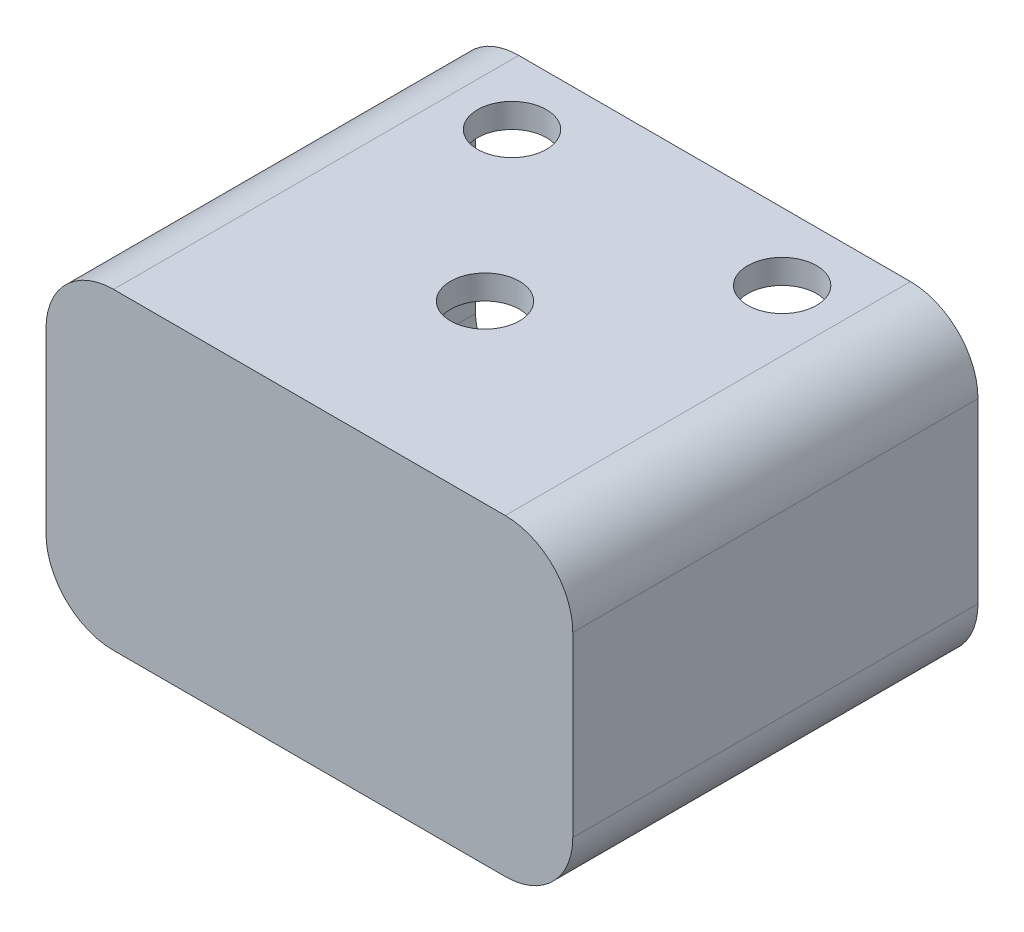
ISO-10303-21;
HEADER;
FILE_DESCRIPTION(('STEP AP214'),'2;1');
FILE_NAME('part.step','',(''),(''),'','','');
FILE_SCHEMA(('AUTOMOTIVE_DESIGN { 1 0 10303 214 1 1 1 1 }'));
ENDSEC;
DATA;
#1=APPLICATION_CONTEXT('core data for automotive mechanical design processes');
#2=APPLICATION_PROTOCOL_DEFINITION('international standard','automotive_design',2000,#1);
#3=PRODUCT_CONTEXT('',#1,'mechanical');
#4=PRODUCT('Part','Part','',(#3));
#5=PRODUCT_RELATED_PRODUCT_CATEGORY('part','',(#4));
#6=PRODUCT_DEFINITION_FORMATION('','',#4);
#7=PRODUCT_DEFINITION_CONTEXT('part definition',#1,'design');
#8=PRODUCT_DEFINITION('design','',#6,#7);
#9=PRODUCT_DEFINITION_SHAPE('','',#8);
#10=(LENGTH_UNIT() NAMED_UNIT(*) SI_UNIT(.MILLI.,.METRE.));
#11=(NAMED_UNIT(*) PLANE_ANGLE_UNIT() SI_UNIT($,.RADIAN.));
#12=(NAMED_UNIT(*) SI_UNIT($,.STERADIAN.) SOLID_ANGLE_UNIT());
#13=UNCERTAINTY_MEASURE_WITH_UNIT(LENGTH_MEASURE(1.E-05),#10,'distance_accuracy_value','');
#14=(GEOMETRIC_REPRESENTATION_CONTEXT(3) GLOBAL_UNCERTAINTY_ASSIGNED_CONTEXT((#13)) GLOBAL_UNIT_ASSIGNED_CONTEXT((#10,
#11,#12)) REPRESENTATION_CONTEXT('',''));
#15=CARTESIAN_POINT('',(0.,0.,0.));
#16=DIRECTION('',(0.,0.,1.));
#17=DIRECTION('',(1.,0.,0.));
#18=AXIS2_PLACEMENT_3D('',#15,#16,#17);
#19=CARTESIAN_POINT('',(30.5,1.5,309.8));
#20=DIRECTION('',(0.,0.,-1.));
#21=DIRECTION('',(-1.,0.,0.));
#22=AXIS2_PLACEMENT_3D('',#19,#20,#21);
#23=CYLINDRICAL_SURFACE('',#22,5.);
#24=DIRECTION('',(0.,0.,-1.));
#25=VECTOR('',#24,1.);
#26=CARTESIAN_POINT('',(30.5,-3.5,309.8));
#27=LINE('',#26,#25);
#28=CARTESIAN_POINT('',(30.5,-3.5,309.8));
#29=VERTEX_POINT('',#28);
#30=CARTESIAN_POINT('',(30.5,-3.5,279.8));
#31=VERTEX_POINT('',#30);
#32=EDGE_CURVE('E261',#29,#31,#27,.T.);
#33=ORIENTED_EDGE('',*,*,#32,.T.);
#34=CARTESIAN_POINT('',(30.5,1.5,279.8));
#35=DIRECTION('',(0.,0.,-1.));
#36=DIRECTION('',(-1.,0.,0.));
#37=AXIS2_PLACEMENT_3D('',#34,#35,#36);
#38=CIRCLE('',#37,5.);
#39=CARTESIAN_POINT('',(35.5,1.50000000000001,279.8));
#40=VERTEX_POINT('',#39);
#41=EDGE_CURVE('E168',#40,#31,#38,.T.);
#42=ORIENTED_EDGE('',*,*,#41,.F.);
#43=DIRECTION('',(0.,0.,-1.));
#44=VECTOR('',#43,1.);
#45=CARTESIAN_POINT('',(35.5,1.5,309.8));
#46=LINE('',#45,#44);
#47=CARTESIAN_POINT('',(35.5,1.5,309.8));
#48=VERTEX_POINT('',#47);
#49=EDGE_CURVE('E11',#48,#40,#46,.T.);
#50=ORIENTED_EDGE('',*,*,#49,.F.);
#51=CARTESIAN_POINT('',(30.5,1.5,309.8));
#52=DIRECTION('',(0.,0.,1.));
#53=DIRECTION('',(1.,0.,0.));
#54=AXIS2_PLACEMENT_3D('',#51,#52,#53);
#55=CIRCLE('',#54,5.);
#56=EDGE_CURVE('E246',#29,#48,#55,.T.);
#57=ORIENTED_EDGE('',*,*,#56,.F.);
#58=EDGE_LOOP('',(#33,#42,#50,#57));
#59=FACE_BOUND('',#58,.T.);
#60=ADVANCED_FACE('F37',(#59),#23,.T.);
#61=CARTESIAN_POINT('',(35.5,1.5,309.8));
#62=DIRECTION('',(-1.,0.,0.));
#63=DIRECTION('',(0.,0.,1.));
#64=AXIS2_PLACEMENT_3D('',#61,#62,#63);
#65=PLANE('',#64);
#66=ORIENTED_EDGE('',*,*,#49,.T.);
#67=DIRECTION('',(0.,-1.,0.));
#68=VECTOR('',#67,1.);
#69=CARTESIAN_POINT('',(35.5,14.65,279.8));
#70=LINE('',#69,#68);
#71=CARTESIAN_POINT('',(35.5,14.65,279.8));
#72=VERTEX_POINT('',#71);
#73=EDGE_CURVE('E243',#72,#40,#70,.T.);
#74=ORIENTED_EDGE('',*,*,#73,.F.);
#75=DIRECTION('',(0.,0.,-1.));
#76=VECTOR('',#75,1.);
#77=CARTESIAN_POINT('',(35.5,14.65,309.8));
#78=LINE('',#77,#76);
#79=CARTESIAN_POINT('',(35.5,14.65,309.8));
#80=VERTEX_POINT('',#79);
#81=EDGE_CURVE('E45',#80,#72,#78,.T.);
#82=ORIENTED_EDGE('',*,*,#81,.F.);
#83=DIRECTION('',(0.,1.,0.));
#84=VECTOR('',#83,1.);
#85=CARTESIAN_POINT('',(35.5,1.5,309.8));
#86=LINE('',#85,#84);
#87=EDGE_CURVE('E248',#48,#80,#86,.T.);
#88=ORIENTED_EDGE('',*,*,#87,.F.);
#89=EDGE_LOOP('',(#66,#74,#82,#88));
#90=FACE_BOUND('',#89,.T.);
#91=ADVANCED_FACE('F336',(#90),#65,.F.);
#92=CARTESIAN_POINT('',(30.5,14.65,309.8));
#93=DIRECTION('',(0.,0.,-1.));
#94=DIRECTION('',(-1.,0.,0.));
#95=AXIS2_PLACEMENT_3D('',#92,#93,#94);
#96=CYLINDRICAL_SURFACE('',#95,5.00000000000001);
#97=ORIENTED_EDGE('',*,*,#81,.T.);
#98=CARTESIAN_POINT('',(30.5,14.65,279.8));
#99=DIRECTION('',(0.,0.,-1.));
#100=DIRECTION('',(-1.,0.,0.));
#101=AXIS2_PLACEMENT_3D('',#98,#99,#100);
#102=CIRCLE('',#101,5.00000000000001);
#103=CARTESIAN_POINT('',(30.5,19.65,279.8));
#104=VERTEX_POINT('',#103);
#105=EDGE_CURVE('E240',#104,#72,#102,.T.);
#106=ORIENTED_EDGE('',*,*,#105,.F.);
#107=DIRECTION('',(0.,0.,-1.));
#108=VECTOR('',#107,1.);
#109=CARTESIAN_POINT('',(30.5,19.65,309.8));
#110=LINE('',#109,#108);
#111=CARTESIAN_POINT('',(30.5,19.65,309.8));
#112=VERTEX_POINT('',#111);
#113=EDGE_CURVE('E271',#112,#104,#110,.T.);
#114=ORIENTED_EDGE('',*,*,#113,.F.);
#115=CARTESIAN_POINT('',(30.5,14.65,309.8));
#116=DIRECTION('',(0.,0.,1.));
#117=DIRECTION('',(1.,0.,0.));
#118=AXIS2_PLACEMENT_3D('',#115,#116,#117);
#119=CIRCLE('',#118,5.00000000000001);
#120=EDGE_CURVE('E250',#80,#112,#119,.T.);
#121=ORIENTED_EDGE('',*,*,#120,.F.);
#122=EDGE_LOOP('',(#97,#106,#114,#121));
#123=FACE_BOUND('',#122,.T.);
#124=ADVANCED_FACE('F341',(#123),#96,.T.);
#125=CARTESIAN_POINT('',(30.5,19.65,309.8));
#126=DIRECTION('',(0.,-1.,0.));
#127=DIRECTION('',(1.,0.,0.));
#128=AXIS2_PLACEMENT_3D('',#125,#126,#127);
#129=PLANE('',#128);
#130=CARTESIAN_POINT('',(16.,19.65,296.8));
#131=DIRECTION('',(0.,1.,0.));
#132=DIRECTION('',(-1.,0.,0.));
#133=AXIS2_PLACEMENT_3D('',#130,#131,#132);
#134=CIRCLE('',#133,2.55);
#135=CARTESIAN_POINT('',(13.45,19.65,296.8));
#136=VERTEX_POINT('',#135);
#137=EDGE_CURVE('E649',#136,#136,#134,.T.);
#138=ORIENTED_EDGE('',*,*,#137,.F.);
#139=EDGE_LOOP('',(#138));
#140=FACE_BOUND('',#139,.T.);
#141=CARTESIAN_POINT('',(26.,19.65,284.8));
#142=DIRECTION('',(0.,1.,0.));
#143=DIRECTION('',(-1.,0.,0.));
#144=AXIS2_PLACEMENT_3D('',#141,#142,#143);
#145=CIRCLE('',#144,2.55);
#146=CARTESIAN_POINT('',(23.45,19.65,284.8));
#147=VERTEX_POINT('',#146);
#148=EDGE_CURVE('E650',#147,#147,#145,.T.);
#149=ORIENTED_EDGE('',*,*,#148,.F.);
#150=EDGE_LOOP('',(#149));
#151=FACE_BOUND('',#150,.T.);
#152=CARTESIAN_POINT('',(5.99999999999999,19.65,284.8));
#153=DIRECTION('',(0.,1.,0.));
#154=DIRECTION('',(-1.,0.,0.));
#155=AXIS2_PLACEMENT_3D('',#152,#153,#154);
#156=CIRCLE('',#155,2.55000000000001);
#157=CARTESIAN_POINT('',(3.44999999999999,19.65,284.8));
#158=VERTEX_POINT('',#157);
#159=EDGE_CURVE('E659',#158,#158,#156,.T.);
#160=ORIENTED_EDGE('',*,*,#159,.F.);
#161=EDGE_LOOP('',(#160));
#162=FACE_BOUND('',#161,.T.);
#163=ORIENTED_EDGE('',*,*,#113,.T.);
#164=DIRECTION('',(1.,0.,0.));
#165=VECTOR('',#164,1.);
#166=CARTESIAN_POINT('',(1.5,19.65,279.8));
#167=LINE('',#166,#165);
#168=CARTESIAN_POINT('',(1.5,19.65,279.8));
#169=VERTEX_POINT('',#168);
#170=EDGE_CURVE('E237',#169,#104,#167,.T.);
#171=ORIENTED_EDGE('',*,*,#170,.F.);
#172=DIRECTION('',(0.,0.,-1.));
#173=VECTOR('',#172,1.);
#174=CARTESIAN_POINT('',(1.5,19.65,309.8));
#175=LINE('',#174,#173);
#176=CARTESIAN_POINT('',(1.5,19.65,309.8));
#177=VERTEX_POINT('',#176);
#178=EDGE_CURVE('E269',#177,#169,#175,.T.);
#179=ORIENTED_EDGE('',*,*,#178,.F.);
#180=DIRECTION('',(-1.,0.,0.));
#181=VECTOR('',#180,1.);
#182=CARTESIAN_POINT('',(30.5,19.65,309.8));
#183=LINE('',#182,#181);
#184=EDGE_CURVE('E252',#112,#177,#183,.T.);
#185=ORIENTED_EDGE('',*,*,#184,.F.);
#186=EDGE_LOOP('',(#163,#171,#179,#185));
#187=FACE_BOUND('',#186,.T.);
#188=ADVANCED_FACE('F379',(#140,#151,#162,#187),#129,.F.);
#189=CARTESIAN_POINT('',(1.5,14.65,309.8));
#190=DIRECTION('',(0.,0.,-1.));
#191=DIRECTION('',(-1.,0.,0.));
#192=AXIS2_PLACEMENT_3D('',#189,#190,#191);
#193=CYLINDRICAL_SURFACE('',#192,5.);
#194=ORIENTED_EDGE('',*,*,#178,.T.);
#195=CARTESIAN_POINT('',(1.5,14.65,279.8));
#196=DIRECTION('',(0.,0.,-1.));
#197=DIRECTION('',(-1.,0.,0.));
#198=AXIS2_PLACEMENT_3D('',#195,#196,#197);
#199=CIRCLE('',#198,5.);
#200=CARTESIAN_POINT('',(-3.5,14.65,279.8));
#201=VERTEX_POINT('',#200);
#202=EDGE_CURVE('E234',#201,#169,#199,.T.);
#203=ORIENTED_EDGE('',*,*,#202,.F.);
#204=DIRECTION('',(0.,0.,-1.));
#205=VECTOR('',#204,1.);
#206=CARTESIAN_POINT('',(-3.5,14.65,309.8));
#207=LINE('',#206,#205);
#208=CARTESIAN_POINT('',(-3.5,14.65,309.8));
#209=VERTEX_POINT('',#208);
#210=EDGE_CURVE('E267',#209,#201,#207,.T.);
#211=ORIENTED_EDGE('',*,*,#210,.F.);
#212=CARTESIAN_POINT('',(1.5,14.65,309.8));
#213=DIRECTION('',(0.,0.,1.));
#214=DIRECTION('',(1.,0.,0.));
#215=AXIS2_PLACEMENT_3D('',#212,#213,#214);
#216=CIRCLE('',#215,5.);
#217=EDGE_CURVE('E254',#177,#209,#216,.T.);
#218=ORIENTED_EDGE('',*,*,#217,.F.);
#219=EDGE_LOOP('',(#194,#203,#211,#218));
#220=FACE_BOUND('',#219,.T.);
#221=ADVANCED_FACE('F375',(#220),#193,.T.);
#222=CARTESIAN_POINT('',(-3.5,14.65,309.8));
#223=DIRECTION('',(1.,0.,0.));
#224=DIRECTION('',(0.,1.,0.));
#225=AXIS2_PLACEMENT_3D('',#222,#223,#224);
#226=PLANE('',#225);
#227=ORIENTED_EDGE('',*,*,#210,.T.);
#228=DIRECTION('',(0.,1.,0.));
#229=VECTOR('',#228,1.);
#230=CARTESIAN_POINT('',(-3.5,1.5,279.8));
#231=LINE('',#230,#229);
#232=CARTESIAN_POINT('',(-3.5,1.5,279.8));
#233=VERTEX_POINT('',#232);
#234=EDGE_CURVE('E231',#233,#201,#231,.T.);
#235=ORIENTED_EDGE('',*,*,#234,.F.);
#236=DIRECTION('',(0.,0.,-1.));
#237=VECTOR('',#236,1.);
#238=CARTESIAN_POINT('',(-3.5,1.5,309.8));
#239=LINE('',#238,#237);
#240=CARTESIAN_POINT('',(-3.5,1.5,309.8));
#241=VERTEX_POINT('',#240);
#242=EDGE_CURVE('E265',#241,#233,#239,.T.);
#243=ORIENTED_EDGE('',*,*,#242,.F.);
#244=DIRECTION('',(0.,-1.,0.));
#245=VECTOR('',#244,1.);
#246=CARTESIAN_POINT('',(-3.5,14.65,309.8));
#247=LINE('',#246,#245);
#248=EDGE_CURVE('E256',#209,#241,#247,.T.);
#249=ORIENTED_EDGE('',*,*,#248,.F.);
#250=EDGE_LOOP('',(#227,#235,#243,#249));
#251=FACE_BOUND('',#250,.T.);
#252=ADVANCED_FACE('F371',(#251),#226,.F.);
#253=CARTESIAN_POINT('',(1.5,1.5,309.8));
#254=DIRECTION('',(0.,0.,-1.));
#255=DIRECTION('',(-1.,0.,0.));
#256=AXIS2_PLACEMENT_3D('',#253,#254,#255);
#257=CYLINDRICAL_SURFACE('',#256,5.);
#258=ORIENTED_EDGE('',*,*,#242,.T.);
#259=CARTESIAN_POINT('',(1.5,1.5,279.8));
#260=DIRECTION('',(0.,0.,-1.));
#261=DIRECTION('',(-1.,0.,0.));
#262=AXIS2_PLACEMENT_3D('',#259,#260,#261);
#263=CIRCLE('',#262,5.);
#264=CARTESIAN_POINT('',(1.5,-3.5,279.8));
#265=VERTEX_POINT('',#264);
#266=EDGE_CURVE('E228',#265,#233,#263,.T.);
#267=ORIENTED_EDGE('',*,*,#266,.F.);
#268=DIRECTION('',(0.,0.,-1.));
#269=VECTOR('',#268,1.);
#270=CARTESIAN_POINT('',(1.5,-3.5,309.8));
#271=LINE('',#270,#269);
#272=CARTESIAN_POINT('',(1.5,-3.5,309.8));
#273=VERTEX_POINT('',#272);
#274=EDGE_CURVE('E263',#273,#265,#271,.T.);
#275=ORIENTED_EDGE('',*,*,#274,.F.);
#276=CARTESIAN_POINT('',(1.5,1.5,309.8));
#277=DIRECTION('',(0.,0.,1.));
#278=DIRECTION('',(1.,0.,0.));
#279=AXIS2_PLACEMENT_3D('',#276,#277,#278);
#280=CIRCLE('',#279,5.);
#281=EDGE_CURVE('E258',#241,#273,#280,.T.);
#282=ORIENTED_EDGE('',*,*,#281,.F.);
#283=EDGE_LOOP('',(#258,#267,#275,#282));
#284=FACE_BOUND('',#283,.T.);
#285=ADVANCED_FACE('F364',(#284),#257,.T.);
#286=CARTESIAN_POINT('',(1.5,-3.5,309.8));
#287=DIRECTION('',(0.,1.,0.));
#288=DIRECTION('',(-1.,0.,0.));
#289=AXIS2_PLACEMENT_3D('',#286,#287,#288);
#290=PLANE('',#289);
#291=CARTESIAN_POINT('',(16.,-3.5,296.8));
#292=DIRECTION('',(0.,1.,0.));
#293=DIRECTION('',(-1.,0.,0.));
#294=AXIS2_PLACEMENT_3D('',#291,#292,#293);
#295=CIRCLE('',#294,2.55);
#296=CARTESIAN_POINT('',(13.45,-3.5,296.8));
#297=VERTEX_POINT('',#296);
#298=EDGE_CURVE('E277',#297,#297,#295,.T.);
#299=ORIENTED_EDGE('',*,*,#298,.T.);
#300=EDGE_LOOP('',(#299));
#301=FACE_BOUND('',#300,.T.);
#302=CARTESIAN_POINT('',(26.,-3.5,284.8));
#303=DIRECTION('',(0.,1.,0.));
#304=DIRECTION('',(-1.,0.,0.));
#305=AXIS2_PLACEMENT_3D('',#302,#303,#304);
#306=CIRCLE('',#305,2.55);
#307=CARTESIAN_POINT('',(23.45,-3.5,284.8));
#308=VERTEX_POINT('',#307);
#309=EDGE_CURVE('E655',#308,#308,#306,.T.);
#310=ORIENTED_EDGE('',*,*,#309,.T.);
#311=EDGE_LOOP('',(#310));
#312=FACE_BOUND('',#311,.T.);
#313=CARTESIAN_POINT('',(5.99999999999999,-3.50000000000001,284.8));
#314=DIRECTION('',(0.,1.,0.));
#315=DIRECTION('',(-1.,0.,0.));
#316=AXIS2_PLACEMENT_3D('',#313,#314,#315);
#317=CIRCLE('',#316,2.55000000000001);
#318=CARTESIAN_POINT('',(3.44999999999999,-3.50000000000001,284.8));
#319=VERTEX_POINT('',#318);
#320=EDGE_CURVE('E290',#319,#319,#317,.T.);
#321=ORIENTED_EDGE('',*,*,#320,.T.);
#322=EDGE_LOOP('',(#321));
#323=FACE_BOUND('',#322,.T.);
#324=ORIENTED_EDGE('',*,*,#274,.T.);
#325=DIRECTION('',(-1.,0.,0.));
#326=VECTOR('',#325,1.);
#327=CARTESIAN_POINT('',(30.5,-3.5,279.8));
#328=LINE('',#327,#326);
#329=EDGE_CURVE('E225',#31,#265,#328,.T.);
#330=ORIENTED_EDGE('',*,*,#329,.F.);
#331=ORIENTED_EDGE('',*,*,#32,.F.);
#332=DIRECTION('',(1.,0.,0.));
#333=VECTOR('',#332,1.);
#334=CARTESIAN_POINT('',(1.5,-3.5,309.8));
#335=LINE('',#334,#333);
#336=EDGE_CURVE('E61',#273,#29,#335,.T.);
#337=ORIENTED_EDGE('',*,*,#336,.F.);
#338=EDGE_LOOP('',(#324,#330,#331,#337));
#339=FACE_BOUND('',#338,.T.);
#340=ADVANCED_FACE('F348',(#301,#312,#323,#339),#290,.F.);
#341=CARTESIAN_POINT('',(30.5,1.5,309.8));
#342=DIRECTION('',(0.,0.,1.));
#343=DIRECTION('',(1.,0.,0.));
#344=AXIS2_PLACEMENT_3D('',#341,#342,#343);
#345=PLANE('',#344);
#346=ORIENTED_EDGE('',*,*,#56,.T.);
#347=ORIENTED_EDGE('',*,*,#87,.T.);
#348=ORIENTED_EDGE('',*,*,#120,.T.);
#349=ORIENTED_EDGE('',*,*,#184,.T.);
#350=ORIENTED_EDGE('',*,*,#217,.T.);
#351=ORIENTED_EDGE('',*,*,#248,.T.);
#352=ORIENTED_EDGE('',*,*,#281,.T.);
#353=ORIENTED_EDGE('',*,*,#336,.T.);
#354=EDGE_LOOP('',(#346,#347,#348,#349,#350,#351,#352,#353));
#355=FACE_BOUND('',#354,.T.);
#356=ADVANCED_FACE('F356',(#355),#345,.T.);
#357=CARTESIAN_POINT('',(30.5,1.5,279.8));
#358=DIRECTION('',(0.,0.,-1.));
#359=DIRECTION('',(-1.,0.,0.));
#360=AXIS2_PLACEMENT_3D('',#357,#358,#359);
#361=PLANE('',#360);
#362=ORIENTED_EDGE('',*,*,#41,.T.);
#363=ORIENTED_EDGE('',*,*,#329,.T.);
#364=ORIENTED_EDGE('',*,*,#266,.T.);
#365=ORIENTED_EDGE('',*,*,#234,.T.);
#366=ORIENTED_EDGE('',*,*,#202,.T.);
#367=ORIENTED_EDGE('',*,*,#170,.T.);
#368=ORIENTED_EDGE('',*,*,#105,.T.);
#369=ORIENTED_EDGE('',*,*,#73,.T.);
#370=EDGE_LOOP('',(#362,#363,#364,#365,#366,#367,#368,#369));
#371=FACE_BOUND('',#370,.T.);
#372=DIRECTION('',(1.,0.,0.));
#373=VECTOR('',#372,1.);
#374=CARTESIAN_POINT('',(1.5,17.85,279.8));
#375=LINE('',#374,#373);
#376=CARTESIAN_POINT('',(1.5,17.85,279.8));
#377=VERTEX_POINT('',#376);
#378=CARTESIAN_POINT('',(30.5,17.85,279.8));
#379=VERTEX_POINT('',#378);
#380=EDGE_CURVE('E160',#377,#379,#375,.T.);
#381=ORIENTED_EDGE('',*,*,#380,.F.);
#382=CARTESIAN_POINT('',(1.5,14.65,279.8));
#383=DIRECTION('',(0.,0.,-1.));
#384=DIRECTION('',(-1.,0.,0.));
#385=AXIS2_PLACEMENT_3D('',#382,#383,#384);
#386=CIRCLE('',#385,3.2);
#387=CARTESIAN_POINT('',(-1.7,14.65,279.8));
#388=VERTEX_POINT('',#387);
#389=EDGE_CURVE('E152',#388,#377,#386,.T.);
#390=ORIENTED_EDGE('',*,*,#389,.F.);
#391=DIRECTION('',(0.,1.,0.));
#392=VECTOR('',#391,1.);
#393=CARTESIAN_POINT('',(-1.7,1.5,279.8));
#394=LINE('',#393,#392);
#395=CARTESIAN_POINT('',(-1.7,1.5,279.8));
#396=VERTEX_POINT('',#395);
#397=EDGE_CURVE('E188',#396,#388,#394,.T.);
#398=ORIENTED_EDGE('',*,*,#397,.F.);
#399=CARTESIAN_POINT('',(1.5,1.5,279.8));
#400=DIRECTION('',(0.,0.,-1.));
#401=DIRECTION('',(-1.,0.,0.));
#402=AXIS2_PLACEMENT_3D('',#399,#400,#401);
#403=CIRCLE('',#402,3.2);
#404=CARTESIAN_POINT('',(1.50000000000001,-1.7,279.8));
#405=VERTEX_POINT('',#404);
#406=EDGE_CURVE('E185',#405,#396,#403,.T.);
#407=ORIENTED_EDGE('',*,*,#406,.F.);
#408=DIRECTION('',(-1.,0.,0.));
#409=VECTOR('',#408,1.);
#410=CARTESIAN_POINT('',(30.5,-1.7,279.8));
#411=LINE('',#410,#409);
#412=CARTESIAN_POINT('',(30.5,-1.69999999999999,279.8));
#413=VERTEX_POINT('',#412);
#414=EDGE_CURVE('E183',#413,#405,#411,.T.);
#415=ORIENTED_EDGE('',*,*,#414,.F.);
#416=CARTESIAN_POINT('',(30.5,1.5,279.8));
#417=DIRECTION('',(0.,0.,-1.));
#418=DIRECTION('',(-1.,0.,0.));
#419=AXIS2_PLACEMENT_3D('',#416,#417,#418);
#420=CIRCLE('',#419,3.2);
#421=CARTESIAN_POINT('',(33.7,1.5,279.8));
#422=VERTEX_POINT('',#421);
#423=EDGE_CURVE('E181',#422,#413,#420,.T.);
#424=ORIENTED_EDGE('',*,*,#423,.F.);
#425=DIRECTION('',(0.,-1.,0.));
#426=VECTOR('',#425,1.);
#427=CARTESIAN_POINT('',(33.7,14.65,279.8));
#428=LINE('',#427,#426);
#429=CARTESIAN_POINT('',(33.7,14.65,279.8));
#430=VERTEX_POINT('',#429);
#431=EDGE_CURVE('E176',#430,#422,#428,.T.);
#432=ORIENTED_EDGE('',*,*,#431,.F.);
#433=CARTESIAN_POINT('',(30.5,14.65,279.8));
#434=DIRECTION('',(0.,0.,-1.));
#435=DIRECTION('',(-1.,0.,0.));
#436=AXIS2_PLACEMENT_3D('',#433,#434,#435);
#437=CIRCLE('',#436,3.2);
#438=EDGE_CURVE('E174',#379,#430,#437,.T.);
#439=ORIENTED_EDGE('',*,*,#438,.F.);
#440=EDGE_LOOP('',(#381,#390,#398,#407,#415,#424,#432,#439));
#441=FACE_BOUND('',#440,.T.);
#442=ADVANCED_FACE('F172',(#371,#441),#361,.T.);
#443=CARTESIAN_POINT('',(1.5,14.65,279.8));
#444=DIRECTION('',(0.,0.,1.));
#445=DIRECTION('',(1.,0.,0.));
#446=AXIS2_PLACEMENT_3D('',#443,#444,#445);
#447=CYLINDRICAL_SURFACE('',#446,3.2);
#448=CARTESIAN_POINT('',(1.5,14.65,304.8));
#449=DIRECTION('',(0.,0.,-1.));
#450=DIRECTION('',(-1.,0.,0.));
#451=AXIS2_PLACEMENT_3D('',#448,#449,#450);
#452=CIRCLE('',#451,3.2);
#453=CARTESIAN_POINT('',(-1.7,14.65,304.8));
#454=VERTEX_POINT('',#453);
#455=CARTESIAN_POINT('',(1.5,17.85,304.8));
#456=VERTEX_POINT('',#455);
#457=EDGE_CURVE('E190',#454,#456,#452,.T.);
#458=ORIENTED_EDGE('',*,*,#457,.F.);
#459=DIRECTION('',(0.,0.,1.));
#460=VECTOR('',#459,1.);
#461=CARTESIAN_POINT('',(-1.7,14.65,279.8));
#462=LINE('',#461,#460);
#463=EDGE_CURVE('E53',#388,#454,#462,.T.);
#464=ORIENTED_EDGE('',*,*,#463,.F.);
#465=ORIENTED_EDGE('',*,*,#389,.T.);
#466=DIRECTION('',(0.,0.,1.));
#467=VECTOR('',#466,1.);
#468=CARTESIAN_POINT('',(1.5,17.85,279.8));
#469=LINE('',#468,#467);
#470=EDGE_CURVE('E155',#377,#456,#469,.T.);
#471=ORIENTED_EDGE('',*,*,#470,.T.);
#472=EDGE_LOOP('',(#458,#464,#465,#471));
#473=FACE_BOUND('',#472,.T.);
#474=ADVANCED_FACE('F154',(#473),#447,.F.);
#475=CARTESIAN_POINT('',(1.5,17.85,279.8));
#476=DIRECTION('',(0.,-1.,0.));
#477=DIRECTION('',(0.,0.,-1.));
#478=AXIS2_PLACEMENT_3D('',#475,#476,#477);
#479=PLANE('',#478);
#480=CARTESIAN_POINT('',(16.,17.85,296.8));
#481=DIRECTION('',(0.,-1.,0.));
#482=DIRECTION('',(0.,0.,-1.));
#483=AXIS2_PLACEMENT_3D('',#480,#481,#482);
#484=CIRCLE('',#483,2.55);
#485=CARTESIAN_POINT('',(16.,17.85,294.25));
#486=VERTEX_POINT('',#485);
#487=EDGE_CURVE('E192',#486,#486,#484,.T.);
#488=ORIENTED_EDGE('',*,*,#487,.F.);
#489=EDGE_LOOP('',(#488));
#490=FACE_BOUND('',#489,.T.);
#491=CARTESIAN_POINT('',(26.,17.85,284.8));
#492=DIRECTION('',(0.,-1.,0.));
#493=DIRECTION('',(0.,0.,-1.));
#494=AXIS2_PLACEMENT_3D('',#491,#492,#493);
#495=CIRCLE('',#494,2.55);
#496=CARTESIAN_POINT('',(26.,17.85,282.25));
#497=VERTEX_POINT('',#496);
#498=EDGE_CURVE('E280',#497,#497,#495,.T.);
#499=ORIENTED_EDGE('',*,*,#498,.F.);
#500=EDGE_LOOP('',(#499));
#501=FACE_BOUND('',#500,.T.);
#502=CARTESIAN_POINT('',(5.99999999999999,17.85,284.8));
#503=DIRECTION('',(0.,-1.,0.));
#504=DIRECTION('',(0.,0.,-1.));
#505=AXIS2_PLACEMENT_3D('',#502,#503,#504);
#506=CIRCLE('',#505,2.55000000000001);
#507=CARTESIAN_POINT('',(5.99999999999999,17.85,282.25));
#508=VERTEX_POINT('',#507);
#509=EDGE_CURVE('E276',#508,#508,#506,.T.);
#510=ORIENTED_EDGE('',*,*,#509,.F.);
#511=EDGE_LOOP('',(#510));
#512=FACE_BOUND('',#511,.T.);
#513=DIRECTION('',(1.,0.,0.));
#514=VECTOR('',#513,1.);
#515=CARTESIAN_POINT('',(1.5,17.85,304.8));
#516=LINE('',#515,#514);
#517=CARTESIAN_POINT('',(30.5,17.85,304.8));
#518=VERTEX_POINT('',#517);
#519=EDGE_CURVE('E167',#456,#518,#516,.T.);
#520=ORIENTED_EDGE('',*,*,#519,.F.);
#521=ORIENTED_EDGE('',*,*,#470,.F.);
#522=ORIENTED_EDGE('',*,*,#380,.T.);
#523=DIRECTION('',(0.,0.,1.));
#524=VECTOR('',#523,1.);
#525=CARTESIAN_POINT('',(30.5,17.85,279.8));
#526=LINE('',#525,#524);
#527=EDGE_CURVE('E169',#379,#518,#526,.T.);
#528=ORIENTED_EDGE('',*,*,#527,.T.);
#529=EDGE_LOOP('',(#520,#521,#522,#528));
#530=FACE_BOUND('',#529,.T.);
#531=ADVANCED_FACE('F164',(#490,#501,#512,#530),#479,.T.);
#532=CARTESIAN_POINT('',(30.5,14.65,279.8));
#533=DIRECTION('',(0.,0.,1.));
#534=DIRECTION('',(1.,0.,0.));
#535=AXIS2_PLACEMENT_3D('',#532,#533,#534);
#536=CYLINDRICAL_SURFACE('',#535,3.2);
#537=CARTESIAN_POINT('',(30.5,14.65,304.8));
#538=DIRECTION('',(0.,0.,-1.));
#539=DIRECTION('',(-1.,0.,0.));
#540=AXIS2_PLACEMENT_3D('',#537,#538,#539);
#541=CIRCLE('',#540,3.2);
#542=CARTESIAN_POINT('',(33.7,14.65,304.8));
#543=VERTEX_POINT('',#542);
#544=EDGE_CURVE('E194',#518,#543,#541,.T.);
#545=ORIENTED_EDGE('',*,*,#544,.F.);
#546=ORIENTED_EDGE('',*,*,#527,.F.);
#547=ORIENTED_EDGE('',*,*,#438,.T.);
#548=DIRECTION('',(0.,0.,1.));
#549=VECTOR('',#548,1.);
#550=CARTESIAN_POINT('',(33.7,14.65,279.8));
#551=LINE('',#550,#549);
#552=EDGE_CURVE('E220',#430,#543,#551,.T.);
#553=ORIENTED_EDGE('',*,*,#552,.T.);
#554=EDGE_LOOP('',(#545,#546,#547,#553));
#555=FACE_BOUND('',#554,.T.);
#556=ADVANCED_FACE('F435',(#555),#536,.F.);
#557=CARTESIAN_POINT('',(33.7,14.65,279.8));
#558=DIRECTION('',(-1.,0.,0.));
#559=DIRECTION('',(0.,-1.,0.));
#560=AXIS2_PLACEMENT_3D('',#557,#558,#559);
#561=PLANE('',#560);
#562=DIRECTION('',(0.,-1.,0.));
#563=VECTOR('',#562,1.);
#564=CARTESIAN_POINT('',(33.7,14.65,304.8));
#565=LINE('',#564,#563);
#566=CARTESIAN_POINT('',(33.7,1.5,304.8));
#567=VERTEX_POINT('',#566);
#568=EDGE_CURVE('E197',#543,#567,#565,.T.);
#569=ORIENTED_EDGE('',*,*,#568,.F.);
#570=ORIENTED_EDGE('',*,*,#552,.F.);
#571=ORIENTED_EDGE('',*,*,#431,.T.);
#572=DIRECTION('',(0.,0.,1.));
#573=VECTOR('',#572,1.);
#574=CARTESIAN_POINT('',(33.7,1.5,279.8));
#575=LINE('',#574,#573);
#576=EDGE_CURVE('E218',#422,#567,#575,.T.);
#577=ORIENTED_EDGE('',*,*,#576,.T.);
#578=EDGE_LOOP('',(#569,#570,#571,#577));
#579=FACE_BOUND('',#578,.T.);
#580=ADVANCED_FACE('F531',(#579),#561,.T.);
#581=CARTESIAN_POINT('',(30.5,1.5,279.8));
#582=DIRECTION('',(0.,0.,1.));
#583=DIRECTION('',(1.,0.,0.));
#584=AXIS2_PLACEMENT_3D('',#581,#582,#583);
#585=CYLINDRICAL_SURFACE('',#584,3.2);
#586=CARTESIAN_POINT('',(30.5,1.5,304.8));
#587=DIRECTION('',(0.,0.,-1.));
#588=DIRECTION('',(-1.,0.,0.));
#589=AXIS2_PLACEMENT_3D('',#586,#587,#588);
#590=CIRCLE('',#589,3.2);
#591=CARTESIAN_POINT('',(30.5,-1.69999999999999,304.8));
#592=VERTEX_POINT('',#591);
#593=EDGE_CURVE('E200',#567,#592,#590,.T.);
#594=ORIENTED_EDGE('',*,*,#593,.F.);
#595=ORIENTED_EDGE('',*,*,#576,.F.);
#596=ORIENTED_EDGE('',*,*,#423,.T.);
#597=DIRECTION('',(0.,0.,1.));
#598=VECTOR('',#597,1.);
#599=CARTESIAN_POINT('',(30.5,-1.69999999999999,279.8));
#600=LINE('',#599,#598);
#601=EDGE_CURVE('E216',#413,#592,#600,.T.);
#602=ORIENTED_EDGE('',*,*,#601,.T.);
#603=EDGE_LOOP('',(#594,#595,#596,#602));
#604=FACE_BOUND('',#603,.T.);
#605=ADVANCED_FACE('F305',(#604),#585,.F.);
#606=CARTESIAN_POINT('',(30.5,-1.7,279.8));
#607=DIRECTION('',(0.,1.,0.));
#608=DIRECTION('',(-1.,0.,0.));
#609=AXIS2_PLACEMENT_3D('',#606,#607,#608);
#610=PLANE('',#609);
#611=CARTESIAN_POINT('',(16.,-1.7,296.8));
#612=DIRECTION('',(0.,1.,0.));
#613=DIRECTION('',(-1.,0.,0.));
#614=AXIS2_PLACEMENT_3D('',#611,#612,#613);
#615=CIRCLE('',#614,2.55);
#616=CARTESIAN_POINT('',(13.45,-1.7,296.8));
#617=VERTEX_POINT('',#616);
#618=EDGE_CURVE('E40',#617,#617,#615,.T.);
#619=ORIENTED_EDGE('',*,*,#618,.F.);
#620=EDGE_LOOP('',(#619));
#621=FACE_BOUND('',#620,.T.);
#622=CARTESIAN_POINT('',(26.,-1.7,284.8));
#623=DIRECTION('',(0.,1.,0.));
#624=DIRECTION('',(-1.,0.,0.));
#625=AXIS2_PLACEMENT_3D('',#622,#623,#624);
#626=CIRCLE('',#625,2.55);
#627=CARTESIAN_POINT('',(23.45,-1.7,284.8));
#628=VERTEX_POINT('',#627);
#629=EDGE_CURVE('E278',#628,#628,#626,.T.);
#630=ORIENTED_EDGE('',*,*,#629,.F.);
#631=EDGE_LOOP('',(#630));
#632=FACE_BOUND('',#631,.T.);
#633=CARTESIAN_POINT('',(5.99999999999999,-1.7,284.8));
#634=DIRECTION('',(0.,1.,0.));
#635=DIRECTION('',(-1.,0.,0.));
#636=AXIS2_PLACEMENT_3D('',#633,#634,#635);
#637=CIRCLE('',#636,2.55000000000001);
#638=CARTESIAN_POINT('',(3.44999999999999,-1.7,284.8));
#639=VERTEX_POINT('',#638);
#640=EDGE_CURVE('E274',#639,#639,#637,.T.);
#641=ORIENTED_EDGE('',*,*,#640,.F.);
#642=EDGE_LOOP('',(#641));
#643=FACE_BOUND('',#642,.T.);
#644=DIRECTION('',(-1.,0.,0.));
#645=VECTOR('',#644,1.);
#646=CARTESIAN_POINT('',(30.5,-1.7,304.8));
#647=LINE('',#646,#645);
#648=CARTESIAN_POINT('',(1.50000000000001,-1.7,304.8));
#649=VERTEX_POINT('',#648);
#650=EDGE_CURVE('E203',#592,#649,#647,.T.);
#651=ORIENTED_EDGE('',*,*,#650,.F.);
#652=ORIENTED_EDGE('',*,*,#601,.F.);
#653=ORIENTED_EDGE('',*,*,#414,.T.);
#654=DIRECTION('',(0.,0.,1.));
#655=VECTOR('',#654,1.);
#656=CARTESIAN_POINT('',(1.50000000000001,-1.7,279.8));
#657=LINE('',#656,#655);
#658=EDGE_CURVE('E214',#405,#649,#657,.T.);
#659=ORIENTED_EDGE('',*,*,#658,.T.);
#660=EDGE_LOOP('',(#651,#652,#653,#659));
#661=FACE_BOUND('',#660,.T.);
#662=ADVANCED_FACE('F301',(#621,#632,#643,#661),#610,.T.);
#663=CARTESIAN_POINT('',(1.5,1.5,279.8));
#664=DIRECTION('',(0.,0.,1.));
#665=DIRECTION('',(1.,0.,0.));
#666=AXIS2_PLACEMENT_3D('',#663,#664,#665);
#667=CYLINDRICAL_SURFACE('',#666,3.2);
#668=CARTESIAN_POINT('',(1.5,1.5,304.8));
#669=DIRECTION('',(0.,0.,-1.));
#670=DIRECTION('',(-1.,0.,0.));
#671=AXIS2_PLACEMENT_3D('',#668,#669,#670);
#672=CIRCLE('',#671,3.2);
#673=CARTESIAN_POINT('',(-1.7,1.5,304.8));
#674=VERTEX_POINT('',#673);
#675=EDGE_CURVE('E206',#649,#674,#672,.T.);
#676=ORIENTED_EDGE('',*,*,#675,.F.);
#677=ORIENTED_EDGE('',*,*,#658,.F.);
#678=ORIENTED_EDGE('',*,*,#406,.T.);
#679=DIRECTION('',(0.,0.,1.));
#680=VECTOR('',#679,1.);
#681=CARTESIAN_POINT('',(-1.7,1.5,279.8));
#682=LINE('',#681,#680);
#683=EDGE_CURVE('E212',#396,#674,#682,.T.);
#684=ORIENTED_EDGE('',*,*,#683,.T.);
#685=EDGE_LOOP('',(#676,#677,#678,#684));
#686=FACE_BOUND('',#685,.T.);
#687=ADVANCED_FACE('F304',(#686),#667,.F.);
#688=CARTESIAN_POINT('',(-1.7,1.5,279.8));
#689=DIRECTION('',(1.,0.,0.));
#690=DIRECTION('',(0.,1.,0.));
#691=AXIS2_PLACEMENT_3D('',#688,#689,#690);
#692=PLANE('',#691);
#693=DIRECTION('',(0.,1.,0.));
#694=VECTOR('',#693,1.);
#695=CARTESIAN_POINT('',(-1.7,1.5,304.8));
#696=LINE('',#695,#694);
#697=EDGE_CURVE('E161',#674,#454,#696,.T.);
#698=ORIENTED_EDGE('',*,*,#697,.F.);
#699=ORIENTED_EDGE('',*,*,#683,.F.);
#700=ORIENTED_EDGE('',*,*,#397,.T.);
#701=ORIENTED_EDGE('',*,*,#463,.T.);
#702=EDGE_LOOP('',(#698,#699,#700,#701));
#703=FACE_BOUND('',#702,.T.);
#704=ADVANCED_FACE('F324',(#703),#692,.T.);
#705=CARTESIAN_POINT('',(30.5,1.5,304.8));
#706=DIRECTION('',(0.,0.,1.));
#707=DIRECTION('',(1.,0.,0.));
#708=AXIS2_PLACEMENT_3D('',#705,#706,#707);
#709=PLANE('',#708);
#710=ORIENTED_EDGE('',*,*,#697,.T.);
#711=ORIENTED_EDGE('',*,*,#457,.T.);
#712=ORIENTED_EDGE('',*,*,#519,.T.);
#713=ORIENTED_EDGE('',*,*,#544,.T.);
#714=ORIENTED_EDGE('',*,*,#568,.T.);
#715=ORIENTED_EDGE('',*,*,#593,.T.);
#716=ORIENTED_EDGE('',*,*,#650,.T.);
#717=ORIENTED_EDGE('',*,*,#675,.T.);
#718=EDGE_LOOP('',(#710,#711,#712,#713,#714,#715,#716,#717));
#719=FACE_BOUND('',#718,.T.);
#720=ADVANCED_FACE('F317',(#719),#709,.F.);
#721=CARTESIAN_POINT('',(5.99999999999999,-3.50000000000001,284.8));
#722=DIRECTION('',(0.,1.,0.));
#723=DIRECTION('',(-1.,0.,0.));
#724=AXIS2_PLACEMENT_3D('',#721,#722,#723);
#725=CYLINDRICAL_SURFACE('',#724,2.55000000000001);
#726=ORIENTED_EDGE('',*,*,#640,.T.);
#727=EDGE_LOOP('',(#726));
#728=FACE_BOUND('',#727,.T.);
#729=ORIENTED_EDGE('',*,*,#320,.F.);
#730=EDGE_LOOP('',(#729));
#731=FACE_BOUND('',#730,.T.);
#732=ADVANCED_FACE('F331',(#728,#731),#725,.F.);
#733=CARTESIAN_POINT('',(26.,-3.5,284.8));
#734=DIRECTION('',(0.,1.,0.));
#735=DIRECTION('',(-1.,0.,0.));
#736=AXIS2_PLACEMENT_3D('',#733,#734,#735);
#737=CYLINDRICAL_SURFACE('',#736,2.55);
#738=ORIENTED_EDGE('',*,*,#629,.T.);
#739=EDGE_LOOP('',(#738));
#740=FACE_BOUND('',#739,.T.);
#741=ORIENTED_EDGE('',*,*,#309,.F.);
#742=EDGE_LOOP('',(#741));
#743=FACE_BOUND('',#742,.T.);
#744=ADVANCED_FACE('F460',(#740,#743),#737,.F.);
#745=CARTESIAN_POINT('',(16.,-3.5,296.8));
#746=DIRECTION('',(0.,1.,0.));
#747=DIRECTION('',(-1.,0.,0.));
#748=AXIS2_PLACEMENT_3D('',#745,#746,#747);
#749=CYLINDRICAL_SURFACE('',#748,2.55);
#750=ORIENTED_EDGE('',*,*,#618,.T.);
#751=EDGE_LOOP('',(#750));
#752=FACE_BOUND('',#751,.T.);
#753=ORIENTED_EDGE('',*,*,#298,.F.);
#754=EDGE_LOOP('',(#753));
#755=FACE_BOUND('',#754,.T.);
#756=ADVANCED_FACE('F298',(#752,#755),#749,.F.);
#757=ORIENTED_EDGE('',*,*,#509,.T.);
#758=EDGE_LOOP('',(#757));
#759=FACE_BOUND('',#758,.T.);
#760=ORIENTED_EDGE('',*,*,#159,.T.);
#761=EDGE_LOOP('',(#760));
#762=FACE_BOUND('',#761,.T.);
#763=ADVANCED_FACE('F462',(#759,#762),#725,.F.);
#764=ORIENTED_EDGE('',*,*,#498,.T.);
#765=EDGE_LOOP('',(#764));
#766=FACE_BOUND('',#765,.T.);
#767=ORIENTED_EDGE('',*,*,#148,.T.);
#768=EDGE_LOOP('',(#767));
#769=FACE_BOUND('',#768,.T.);
#770=ADVANCED_FACE('F473',(#766,#769),#737,.F.);
#771=ORIENTED_EDGE('',*,*,#487,.T.);
#772=EDGE_LOOP('',(#771));
#773=FACE_BOUND('',#772,.T.);
#774=ORIENTED_EDGE('',*,*,#137,.T.);
#775=EDGE_LOOP('',(#774));
#776=FACE_BOUND('',#775,.T.);
#777=ADVANCED_FACE('F483',(#773,#776),#749,.F.);
#778=CLOSED_SHELL('',(#60,#91,#124,#188,#221,#252,#285,#340,#356,#442,#474,#531,#556,#580,#605,
#662,#687,#704,#720,#732,#744,#756,#763,#770,#777));
#779=MANIFOLD_SOLID_BREP('B2',#778);
#780=ADVANCED_BREP_SHAPE_REPRESENTATION('',(#18,#779),#14);
#781=SHAPE_DEFINITION_REPRESENTATION(#9,#780);
ENDSEC;
END-ISO-10303-21;
